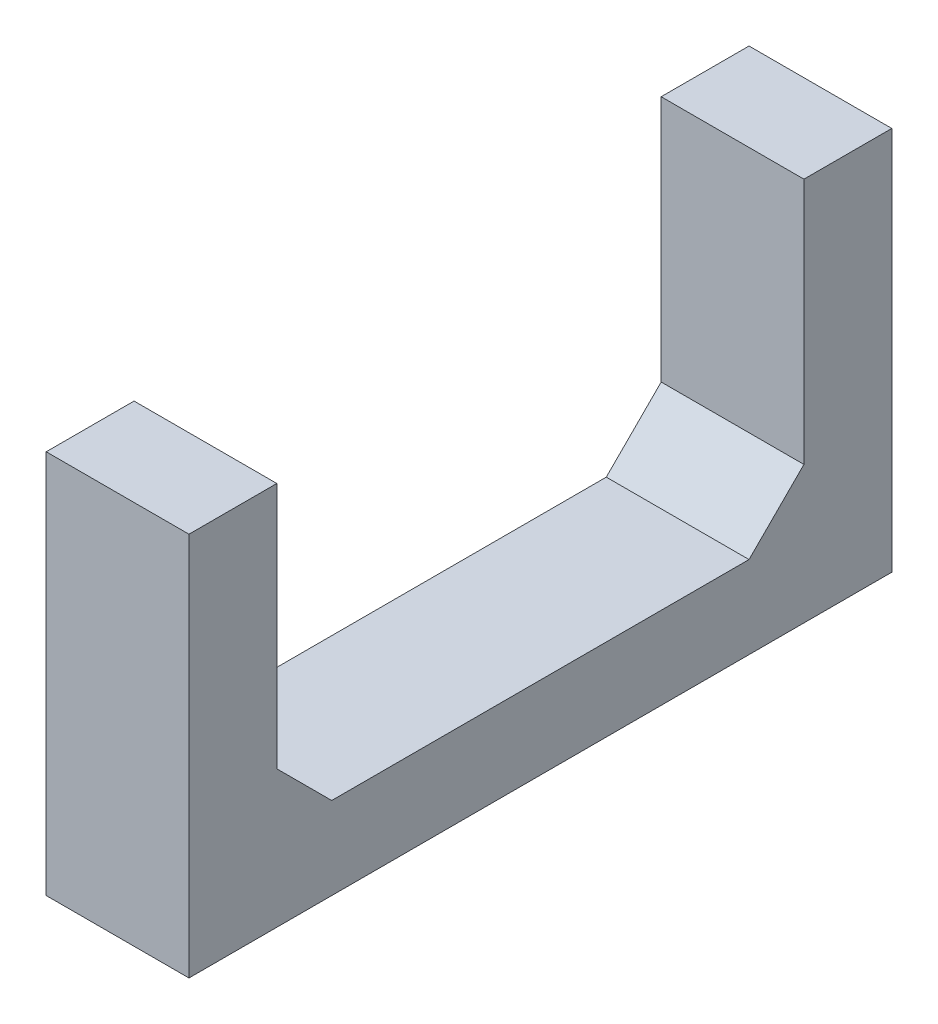
ISO-10303-21;
HEADER;
FILE_DESCRIPTION(('STEP AP214'),'2;1');
FILE_NAME('part.step','',(''),(''),'','','');
FILE_SCHEMA(('AUTOMOTIVE_DESIGN { 1 0 10303 214 1 1 1 1 }'));
ENDSEC;
DATA;
#1=APPLICATION_CONTEXT('core data for automotive mechanical design processes');
#2=APPLICATION_PROTOCOL_DEFINITION('international standard','automotive_design',2000,#1);
#3=PRODUCT_CONTEXT('',#1,'mechanical');
#4=PRODUCT('Part','Part','',(#3));
#5=PRODUCT_RELATED_PRODUCT_CATEGORY('part','',(#4));
#6=PRODUCT_DEFINITION_FORMATION('','',#4);
#7=PRODUCT_DEFINITION_CONTEXT('part definition',#1,'design');
#8=PRODUCT_DEFINITION('design','',#6,#7);
#9=PRODUCT_DEFINITION_SHAPE('','',#8);
#10=(LENGTH_UNIT() NAMED_UNIT(*) SI_UNIT(.MILLI.,.METRE.));
#11=(NAMED_UNIT(*) PLANE_ANGLE_UNIT() SI_UNIT($,.RADIAN.));
#12=(NAMED_UNIT(*) SI_UNIT($,.STERADIAN.) SOLID_ANGLE_UNIT());
#13=UNCERTAINTY_MEASURE_WITH_UNIT(LENGTH_MEASURE(1.E-05),#10,'distance_accuracy_value','');
#14=(GEOMETRIC_REPRESENTATION_CONTEXT(3) GLOBAL_UNCERTAINTY_ASSIGNED_CONTEXT((#13)) GLOBAL_UNIT_ASSIGNED_CONTEXT((#10,
#11,#12)) REPRESENTATION_CONTEXT('',''));
#15=CARTESIAN_POINT('',(0.,0.,0.));
#16=DIRECTION('',(0.,0.,1.));
#17=DIRECTION('',(1.,0.,0.));
#18=AXIS2_PLACEMENT_3D('',#15,#16,#17);
#19=CARTESIAN_POINT('',(26.,0.,-128.));
#20=DIRECTION('',(0.,1.,0.));
#21=DIRECTION('',(0.,0.,1.));
#22=AXIS2_PLACEMENT_3D('',#19,#20,#21);
#23=PLANE('',#22);
#24=DIRECTION('',(0.,0.,-1.));
#25=VECTOR('',#24,1.);
#26=CARTESIAN_POINT('',(0.,0.,-128.));
#27=LINE('',#26,#25);
#28=CARTESIAN_POINT('',(0.,0.,0.));
#29=VERTEX_POINT('',#28);
#30=CARTESIAN_POINT('',(0.,0.,-128.));
#31=VERTEX_POINT('',#30);
#32=EDGE_CURVE('E139',#29,#31,#27,.T.);
#33=ORIENTED_EDGE('',*,*,#32,.T.);
#34=DIRECTION('',(-1.,0.,0.));
#35=VECTOR('',#34,1.);
#36=CARTESIAN_POINT('',(26.,0.,-128.));
#37=LINE('',#36,#35);
#38=CARTESIAN_POINT('',(26.,0.,-128.));
#39=VERTEX_POINT('',#38);
#40=EDGE_CURVE('E119',#39,#31,#37,.T.);
#41=ORIENTED_EDGE('',*,*,#40,.F.);
#42=DIRECTION('',(0.,0.,-1.));
#43=VECTOR('',#42,1.);
#44=CARTESIAN_POINT('',(26.,0.,-128.));
#45=LINE('',#44,#43);
#46=CARTESIAN_POINT('',(26.,0.,0.));
#47=VERTEX_POINT('',#46);
#48=EDGE_CURVE('E126',#47,#39,#45,.T.);
#49=ORIENTED_EDGE('',*,*,#48,.F.);
#50=DIRECTION('',(-1.,0.,0.));
#51=VECTOR('',#50,1.);
#52=CARTESIAN_POINT('',(26.,0.,0.));
#53=LINE('',#52,#51);
#54=EDGE_CURVE('E201',#47,#29,#53,.T.);
#55=ORIENTED_EDGE('',*,*,#54,.T.);
#56=EDGE_LOOP('',(#33,#41,#49,#55));
#57=FACE_BOUND('',#56,.T.);
#58=ADVANCED_FACE('F38',(#57),#23,.F.);
#59=CARTESIAN_POINT('',(26.,70.000000066,-128.));
#60=DIRECTION('',(0.,0.,1.));
#61=DIRECTION('',(0.,-1.,0.));
#62=AXIS2_PLACEMENT_3D('',#59,#60,#61);
#63=PLANE('',#62);
#64=DIRECTION('',(0.,1.,0.));
#65=VECTOR('',#64,1.);
#66=CARTESIAN_POINT('',(0.,70.000000066,-128.));
#67=LINE('',#66,#65);
#68=CARTESIAN_POINT('',(0.,70.000000066,-128.));
#69=VERTEX_POINT('',#68);
#70=EDGE_CURVE('E204',#31,#69,#67,.T.);
#71=ORIENTED_EDGE('',*,*,#70,.T.);
#72=DIRECTION('',(-1.,0.,0.));
#73=VECTOR('',#72,1.);
#74=CARTESIAN_POINT('',(26.,70.000000066,-128.));
#75=LINE('',#74,#73);
#76=CARTESIAN_POINT('',(26.,70.000000066,-128.));
#77=VERTEX_POINT('',#76);
#78=EDGE_CURVE('E122',#77,#69,#75,.T.);
#79=ORIENTED_EDGE('',*,*,#78,.F.);
#80=DIRECTION('',(0.,1.,0.));
#81=VECTOR('',#80,1.);
#82=CARTESIAN_POINT('',(26.,70.000000066,-128.));
#83=LINE('',#82,#81);
#84=EDGE_CURVE('E115',#39,#77,#83,.T.);
#85=ORIENTED_EDGE('',*,*,#84,.F.);
#86=ORIENTED_EDGE('',*,*,#40,.T.);
#87=EDGE_LOOP('',(#71,#79,#85,#86));
#88=FACE_BOUND('',#87,.T.);
#89=ADVANCED_FACE('F117',(#88),#63,.F.);
#90=CARTESIAN_POINT('',(26.,70.000000066,-112.));
#91=DIRECTION('',(0.,-1.,0.));
#92=DIRECTION('',(0.,0.,-1.));
#93=AXIS2_PLACEMENT_3D('',#90,#91,#92);
#94=PLANE('',#93);
#95=DIRECTION('',(0.,0.,1.));
#96=VECTOR('',#95,1.);
#97=CARTESIAN_POINT('',(0.,70.000000066,-112.));
#98=LINE('',#97,#96);
#99=CARTESIAN_POINT('',(0.,70.000000066,-112.));
#100=VERTEX_POINT('',#99);
#101=EDGE_CURVE('E207',#69,#100,#98,.T.);
#102=ORIENTED_EDGE('',*,*,#101,.T.);
#103=DIRECTION('',(-1.,0.,0.));
#104=VECTOR('',#103,1.);
#105=CARTESIAN_POINT('',(26.,70.000000066,-112.));
#106=LINE('',#105,#104);
#107=CARTESIAN_POINT('',(26.,70.000000066,-112.));
#108=VERTEX_POINT('',#107);
#109=EDGE_CURVE('E147',#108,#100,#106,.T.);
#110=ORIENTED_EDGE('',*,*,#109,.F.);
#111=DIRECTION('',(0.,0.,1.));
#112=VECTOR('',#111,1.);
#113=CARTESIAN_POINT('',(26.,70.000000066,-112.));
#114=LINE('',#113,#112);
#115=EDGE_CURVE('E125',#77,#108,#114,.T.);
#116=ORIENTED_EDGE('',*,*,#115,.F.);
#117=ORIENTED_EDGE('',*,*,#78,.T.);
#118=EDGE_LOOP('',(#102,#110,#116,#117));
#119=FACE_BOUND('',#118,.T.);
#120=ADVANCED_FACE('F244',(#119),#94,.F.);
#121=CARTESIAN_POINT('',(26.,15.000000066,-112.));
#122=DIRECTION('',(0.,0.,-1.));
#123=DIRECTION('',(-1.,0.,0.));
#124=AXIS2_PLACEMENT_3D('',#121,#122,#123);
#125=PLANE('',#124);
#126=DIRECTION('',(0.,-1.,0.));
#127=VECTOR('',#126,1.);
#128=CARTESIAN_POINT('',(0.,15.000000066,-112.));
#129=LINE('',#128,#127);
#130=CARTESIAN_POINT('',(0.,25.0000000659999,-112.));
#131=VERTEX_POINT('',#130);
#132=EDGE_CURVE('E179',#100,#131,#129,.T.);
#133=ORIENTED_EDGE('',*,*,#132,.T.);
#134=DIRECTION('',(1.,0.,0.));
#135=VECTOR('',#134,1.);
#136=CARTESIAN_POINT('',(26.,25.0000000659999,-112.));
#137=LINE('',#136,#135);
#138=CARTESIAN_POINT('',(26.,25.0000000659999,-112.));
#139=VERTEX_POINT('',#138);
#140=EDGE_CURVE('E154',#131,#139,#137,.T.);
#141=ORIENTED_EDGE('',*,*,#140,.T.);
#142=DIRECTION('',(0.,-1.,0.));
#143=VECTOR('',#142,1.);
#144=CARTESIAN_POINT('',(26.,15.000000066,-112.));
#145=LINE('',#144,#143);
#146=EDGE_CURVE('E195',#108,#139,#145,.T.);
#147=ORIENTED_EDGE('',*,*,#146,.F.);
#148=ORIENTED_EDGE('',*,*,#109,.T.);
#149=EDGE_LOOP('',(#133,#141,#147,#148));
#150=FACE_BOUND('',#149,.T.);
#151=ADVANCED_FACE('F233',(#150),#125,.F.);
#152=CARTESIAN_POINT('',(26.,15.000000066,-16.));
#153=DIRECTION('',(0.,-1.,0.));
#154=DIRECTION('',(0.,0.,-1.));
#155=AXIS2_PLACEMENT_3D('',#152,#153,#154);
#156=PLANE('',#155);
#157=DIRECTION('',(0.,0.,1.));
#158=VECTOR('',#157,1.);
#159=CARTESIAN_POINT('',(26.,15.000000066,-16.));
#160=LINE('',#159,#158);
#161=CARTESIAN_POINT('',(26.,15.000000066,-102.));
#162=VERTEX_POINT('',#161);
#163=CARTESIAN_POINT('',(26.,15.000000066,-26.));
#164=VERTEX_POINT('',#163);
#165=EDGE_CURVE('E190',#162,#164,#160,.T.);
#166=ORIENTED_EDGE('',*,*,#165,.F.);
#167=DIRECTION('',(-1.,0.,0.));
#168=VECTOR('',#167,1.);
#169=CARTESIAN_POINT('',(0.,15.000000066,-102.));
#170=LINE('',#169,#168);
#171=CARTESIAN_POINT('',(0.,15.000000066,-102.));
#172=VERTEX_POINT('',#171);
#173=EDGE_CURVE('E145',#162,#172,#170,.T.);
#174=ORIENTED_EDGE('',*,*,#173,.T.);
#175=DIRECTION('',(0.,0.,1.));
#176=VECTOR('',#175,1.);
#177=CARTESIAN_POINT('',(0.,15.000000066,-16.));
#178=LINE('',#177,#176);
#179=CARTESIAN_POINT('',(0.,15.000000066,-26.));
#180=VERTEX_POINT('',#179);
#181=EDGE_CURVE('E171',#172,#180,#178,.T.);
#182=ORIENTED_EDGE('',*,*,#181,.T.);
#183=DIRECTION('',(1.,0.,0.));
#184=VECTOR('',#183,1.);
#185=CARTESIAN_POINT('',(26.,15.000000066,-26.));
#186=LINE('',#185,#184);
#187=EDGE_CURVE('E141',#180,#164,#186,.T.);
#188=ORIENTED_EDGE('',*,*,#187,.T.);
#189=EDGE_LOOP('',(#166,#174,#182,#188));
#190=FACE_BOUND('',#189,.T.);
#191=ADVANCED_FACE('F176',(#190),#156,.F.);
#192=CARTESIAN_POINT('',(26.,70.000000066,-16.));
#193=DIRECTION('',(0.,0.,1.));
#194=DIRECTION('',(0.,-1.,0.));
#195=AXIS2_PLACEMENT_3D('',#192,#193,#194);
#196=PLANE('',#195);
#197=DIRECTION('',(0.,1.,0.));
#198=VECTOR('',#197,1.);
#199=CARTESIAN_POINT('',(26.,70.000000066,-16.));
#200=LINE('',#199,#198);
#201=CARTESIAN_POINT('',(26.,25.000000066,-16.));
#202=VERTEX_POINT('',#201);
#203=CARTESIAN_POINT('',(26.,70.000000066,-16.));
#204=VERTEX_POINT('',#203);
#205=EDGE_CURVE('E185',#202,#204,#200,.T.);
#206=ORIENTED_EDGE('',*,*,#205,.F.);
#207=DIRECTION('',(-1.,0.,0.));
#208=VECTOR('',#207,1.);
#209=CARTESIAN_POINT('',(0.,25.000000066,-16.));
#210=LINE('',#209,#208);
#211=CARTESIAN_POINT('',(0.,25.000000066,-16.));
#212=VERTEX_POINT('',#211);
#213=EDGE_CURVE('E157',#202,#212,#210,.T.);
#214=ORIENTED_EDGE('',*,*,#213,.T.);
#215=DIRECTION('',(0.,1.,0.));
#216=VECTOR('',#215,1.);
#217=CARTESIAN_POINT('',(0.,70.000000066,-16.));
#218=LINE('',#217,#216);
#219=CARTESIAN_POINT('',(0.,70.000000066,-16.));
#220=VERTEX_POINT('',#219);
#221=EDGE_CURVE('E173',#212,#220,#218,.T.);
#222=ORIENTED_EDGE('',*,*,#221,.T.);
#223=DIRECTION('',(-1.,0.,0.));
#224=VECTOR('',#223,1.);
#225=CARTESIAN_POINT('',(26.,70.000000066,-16.));
#226=LINE('',#225,#224);
#227=EDGE_CURVE('E186',#204,#220,#226,.T.);
#228=ORIENTED_EDGE('',*,*,#227,.F.);
#229=EDGE_LOOP('',(#206,#214,#222,#228));
#230=FACE_BOUND('',#229,.T.);
#231=ADVANCED_FACE('F182',(#230),#196,.F.);
#232=CARTESIAN_POINT('',(26.,70.000000066,0.));
#233=DIRECTION('',(0.,-1.,0.));
#234=DIRECTION('',(0.,0.,-1.));
#235=AXIS2_PLACEMENT_3D('',#232,#233,#234);
#236=PLANE('',#235);
#237=DIRECTION('',(0.,0.,1.));
#238=VECTOR('',#237,1.);
#239=CARTESIAN_POINT('',(0.,70.000000066,0.));
#240=LINE('',#239,#238);
#241=CARTESIAN_POINT('',(0.,70.000000066,0.));
#242=VERTEX_POINT('',#241);
#243=EDGE_CURVE('E215',#220,#242,#240,.T.);
#244=ORIENTED_EDGE('',*,*,#243,.T.);
#245=DIRECTION('',(-1.,0.,0.));
#246=VECTOR('',#245,1.);
#247=CARTESIAN_POINT('',(26.,70.000000066,0.));
#248=LINE('',#247,#246);
#249=CARTESIAN_POINT('',(26.,70.000000066,0.));
#250=VERTEX_POINT('',#249);
#251=EDGE_CURVE('E222',#250,#242,#248,.T.);
#252=ORIENTED_EDGE('',*,*,#251,.F.);
#253=DIRECTION('',(0.,0.,1.));
#254=VECTOR('',#253,1.);
#255=CARTESIAN_POINT('',(26.,70.000000066,0.));
#256=LINE('',#255,#254);
#257=EDGE_CURVE('E189',#204,#250,#256,.T.);
#258=ORIENTED_EDGE('',*,*,#257,.F.);
#259=ORIENTED_EDGE('',*,*,#227,.T.);
#260=EDGE_LOOP('',(#244,#252,#258,#259));
#261=FACE_BOUND('',#260,.T.);
#262=ADVANCED_FACE('F272',(#261),#236,.F.);
#263=CARTESIAN_POINT('',(26.,0.,0.));
#264=DIRECTION('',(0.,0.,-1.));
#265=DIRECTION('',(-1.,0.,0.));
#266=AXIS2_PLACEMENT_3D('',#263,#264,#265);
#267=PLANE('',#266);
#268=DIRECTION('',(0.,-1.,0.));
#269=VECTOR('',#268,1.);
#270=CARTESIAN_POINT('',(0.,0.,0.));
#271=LINE('',#270,#269);
#272=EDGE_CURVE('E136',#242,#29,#271,.T.);
#273=ORIENTED_EDGE('',*,*,#272,.T.);
#274=ORIENTED_EDGE('',*,*,#54,.F.);
#275=DIRECTION('',(0.,-1.,0.));
#276=VECTOR('',#275,1.);
#277=CARTESIAN_POINT('',(26.,0.,0.));
#278=LINE('',#277,#276);
#279=EDGE_CURVE('E131',#250,#47,#278,.T.);
#280=ORIENTED_EDGE('',*,*,#279,.F.);
#281=ORIENTED_EDGE('',*,*,#251,.T.);
#282=EDGE_LOOP('',(#273,#274,#280,#281));
#283=FACE_BOUND('',#282,.T.);
#284=ADVANCED_FACE('F267',(#283),#267,.F.);
#285=CARTESIAN_POINT('',(26.,0.,0.));
#286=DIRECTION('',(-1.,0.,0.));
#287=DIRECTION('',(0.,0.,1.));
#288=AXIS2_PLACEMENT_3D('',#285,#286,#287);
#289=PLANE('',#288);
#290=ORIENTED_EDGE('',*,*,#48,.T.);
#291=ORIENTED_EDGE('',*,*,#84,.T.);
#292=ORIENTED_EDGE('',*,*,#115,.T.);
#293=ORIENTED_EDGE('',*,*,#146,.T.);
#294=DIRECTION('',(0.,0.707106781186542,-0.707106781186553));
#295=VECTOR('',#294,1.);
#296=CARTESIAN_POINT('',(26.,-43.4999999669999,-43.4999999669992));
#297=LINE('',#296,#295);
#298=EDGE_CURVE('E163',#139,#162,#297,.F.);
#299=ORIENTED_EDGE('',*,*,#298,.T.);
#300=ORIENTED_EDGE('',*,*,#165,.T.);
#301=DIRECTION('',(0.,-0.707106781186551,-0.707106781186544));
#302=VECTOR('',#301,1.);
#303=CARTESIAN_POINT('',(26.,20.5000000329999,-20.5000000330001));
#304=LINE('',#303,#302);
#305=EDGE_CURVE('E11',#164,#202,#304,.F.);
#306=ORIENTED_EDGE('',*,*,#305,.T.);
#307=ORIENTED_EDGE('',*,*,#205,.T.);
#308=ORIENTED_EDGE('',*,*,#257,.T.);
#309=ORIENTED_EDGE('',*,*,#279,.T.);
#310=EDGE_LOOP('',(#290,#291,#292,#293,#299,#300,#306,#307,#308,#309));
#311=FACE_BOUND('',#310,.T.);
#312=ADVANCED_FACE('F129',(#311),#289,.F.);
#313=CARTESIAN_POINT('',(0.,0.,0.));
#314=DIRECTION('',(-1.,0.,0.));
#315=DIRECTION('',(0.,0.,1.));
#316=AXIS2_PLACEMENT_3D('',#313,#314,#315);
#317=PLANE('',#316);
#318=ORIENTED_EDGE('',*,*,#32,.F.);
#319=ORIENTED_EDGE('',*,*,#272,.F.);
#320=ORIENTED_EDGE('',*,*,#243,.F.);
#321=ORIENTED_EDGE('',*,*,#221,.F.);
#322=DIRECTION('',(0.,0.707106781186551,0.707106781186544));
#323=VECTOR('',#322,1.);
#324=CARTESIAN_POINT('',(0.,25.000000066,-16.));
#325=LINE('',#324,#323);
#326=EDGE_CURVE('E47',#212,#180,#325,.F.);
#327=ORIENTED_EDGE('',*,*,#326,.T.);
#328=ORIENTED_EDGE('',*,*,#181,.F.);
#329=DIRECTION('',(0.,-0.707106781186542,0.707106781186553));
#330=VECTOR('',#329,1.);
#331=CARTESIAN_POINT('',(0.,15.000000066,-102.));
#332=LINE('',#331,#330);
#333=EDGE_CURVE('E160',#172,#131,#332,.F.);
#334=ORIENTED_EDGE('',*,*,#333,.T.);
#335=ORIENTED_EDGE('',*,*,#132,.F.);
#336=ORIENTED_EDGE('',*,*,#101,.F.);
#337=ORIENTED_EDGE('',*,*,#70,.F.);
#338=EDGE_LOOP('',(#318,#319,#320,#321,#327,#328,#334,#335,#336,#337));
#339=FACE_BOUND('',#338,.T.);
#340=ADVANCED_FACE('F170',(#339),#317,.T.);
#341=CARTESIAN_POINT('',(26.,15.000000066,-102.));
#342=DIRECTION('',(0.,0.707106781186553,0.707106781186542));
#343=DIRECTION('',(1.,0.,0.));
#344=AXIS2_PLACEMENT_3D('',#341,#342,#343);
#345=PLANE('',#344);
#346=ORIENTED_EDGE('',*,*,#298,.F.);
#347=ORIENTED_EDGE('',*,*,#140,.F.);
#348=ORIENTED_EDGE('',*,*,#333,.F.);
#349=ORIENTED_EDGE('',*,*,#173,.F.);
#350=EDGE_LOOP('',(#346,#347,#348,#349));
#351=FACE_BOUND('',#350,.T.);
#352=ADVANCED_FACE('F240',(#351),#345,.T.);
#353=CARTESIAN_POINT('',(26.,25.000000066,-16.));
#354=DIRECTION('',(0.,0.707106781186544,-0.707106781186551));
#355=DIRECTION('',(1.,0.,0.));
#356=AXIS2_PLACEMENT_3D('',#353,#354,#355);
#357=PLANE('',#356);
#358=ORIENTED_EDGE('',*,*,#305,.F.);
#359=ORIENTED_EDGE('',*,*,#187,.F.);
#360=ORIENTED_EDGE('',*,*,#326,.F.);
#361=ORIENTED_EDGE('',*,*,#213,.F.);
#362=EDGE_LOOP('',(#358,#359,#360,#361));
#363=FACE_BOUND('',#362,.T.);
#364=ADVANCED_FACE('F40',(#363),#357,.T.);
#365=CLOSED_SHELL('',(#58,#89,#120,#151,#191,#231,#262,#284,#312,#340,#352,#364));
#366=MANIFOLD_SOLID_BREP('B2',#365);
#367=ADVANCED_BREP_SHAPE_REPRESENTATION('',(#18,#366),#14);
#368=SHAPE_DEFINITION_REPRESENTATION(#9,#367);
ENDSEC;
END-ISO-10303-21;
